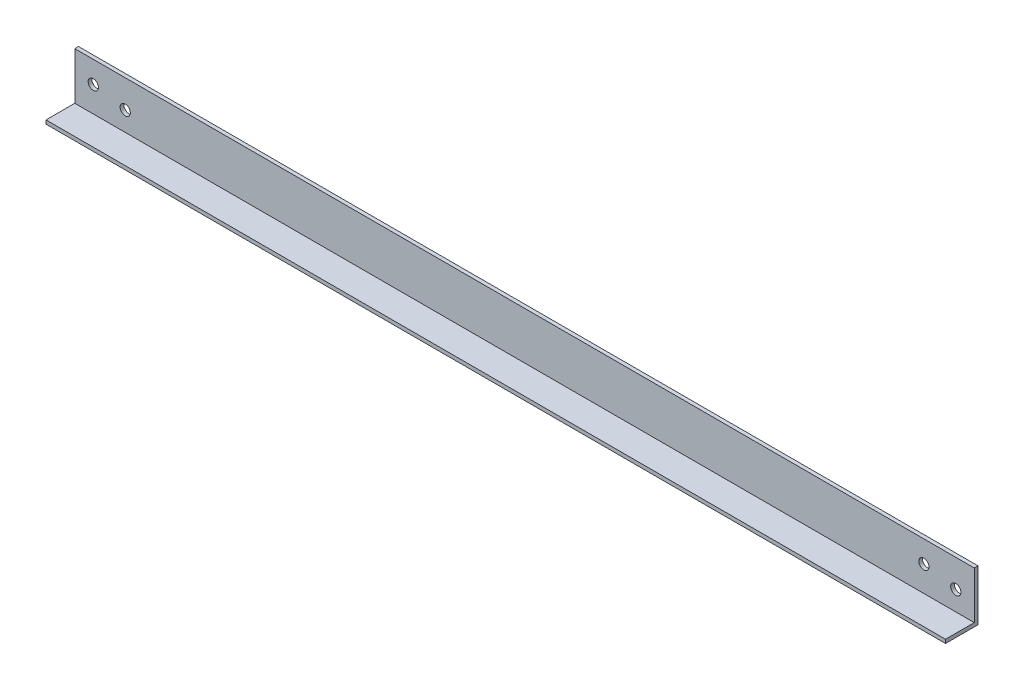
ISO-10303-21;
HEADER;
FILE_DESCRIPTION(('STEP AP214'),'2;1');
FILE_NAME('part.step','',(''),(''),'','','');
FILE_SCHEMA(('AUTOMOTIVE_DESIGN { 1 0 10303 214 1 1 1 1 }'));
ENDSEC;
DATA;
#1=APPLICATION_CONTEXT('core data for automotive mechanical design processes');
#2=APPLICATION_PROTOCOL_DEFINITION('international standard','automotive_design',2000,#1);
#3=PRODUCT_CONTEXT('',#1,'mechanical');
#4=PRODUCT('Part','Part','',(#3));
#5=PRODUCT_RELATED_PRODUCT_CATEGORY('part','',(#4));
#6=PRODUCT_DEFINITION_FORMATION('','',#4);
#7=PRODUCT_DEFINITION_CONTEXT('part definition',#1,'design');
#8=PRODUCT_DEFINITION('design','',#6,#7);
#9=PRODUCT_DEFINITION_SHAPE('','',#8);
#10=(LENGTH_UNIT() NAMED_UNIT(*) SI_UNIT(.MILLI.,.METRE.));
#11=(NAMED_UNIT(*) PLANE_ANGLE_UNIT() SI_UNIT($,.RADIAN.));
#12=(NAMED_UNIT(*) SI_UNIT($,.STERADIAN.) SOLID_ANGLE_UNIT());
#13=UNCERTAINTY_MEASURE_WITH_UNIT(LENGTH_MEASURE(1.E-05),#10,'distance_accuracy_value','');
#14=(GEOMETRIC_REPRESENTATION_CONTEXT(3) GLOBAL_UNCERTAINTY_ASSIGNED_CONTEXT((#13)) GLOBAL_UNIT_ASSIGNED_CONTEXT((#10,
#11,#12)) REPRESENTATION_CONTEXT('',''));
#15=CARTESIAN_POINT('',(0.,0.,0.));
#16=DIRECTION('',(0.,0.,1.));
#17=DIRECTION('',(1.,0.,0.));
#18=AXIS2_PLACEMENT_3D('',#15,#16,#17);
#19=CARTESIAN_POINT('',(0.,110.,8.));
#20=DIRECTION('',(0.,0.,-1.));
#21=DIRECTION('',(-1.,0.,0.));
#22=AXIS2_PLACEMENT_3D('',#19,#20,#21);
#23=PLANE('',#22);
#24=CARTESIAN_POINT('',(39.8880400691979,62.9203216164554,8.));
#25=DIRECTION('',(0.,0.,-1.));
#26=DIRECTION('',(-1.,0.,0.));
#27=AXIS2_PLACEMENT_3D('',#24,#25,#26);
#28=CIRCLE('',#27,11.);
#29=CARTESIAN_POINT('',(28.8880400691979,62.9203216164554,8.));
#30=VERTEX_POINT('',#29);
#31=EDGE_CURVE('E160',#30,#30,#28,.T.);
#32=ORIENTED_EDGE('',*,*,#31,.T.);
#33=EDGE_LOOP('',(#32));
#34=FACE_BOUND('',#33,.T.);
#35=CARTESIAN_POINT('',(108.684226659207,49.9999999999997,8.));
#36=DIRECTION('',(0.,0.,-1.));
#37=DIRECTION('',(-1.,0.,0.));
#38=AXIS2_PLACEMENT_3D('',#35,#36,#37);
#39=CIRCLE('',#38,11.);
#40=CARTESIAN_POINT('',(97.684226659207,49.9999999999997,8.));
#41=VERTEX_POINT('',#40);
#42=EDGE_CURVE('E154',#41,#41,#39,.T.);
#43=ORIENTED_EDGE('',*,*,#42,.T.);
#44=EDGE_LOOP('',(#43));
#45=FACE_BOUND('',#44,.T.);
#46=CARTESIAN_POINT('',(1829.36068952568,62.9203216164554,8.));
#47=DIRECTION('',(0.,0.,-1.));
#48=DIRECTION('',(-1.,0.,0.));
#49=AXIS2_PLACEMENT_3D('',#46,#47,#48);
#50=CIRCLE('',#49,10.9999999999999);
#51=CARTESIAN_POINT('',(1818.36068952568,62.9203216164554,8.));
#52=VERTEX_POINT('',#51);
#53=EDGE_CURVE('E148',#52,#52,#50,.T.);
#54=ORIENTED_EDGE('',*,*,#53,.T.);
#55=EDGE_LOOP('',(#54));
#56=FACE_BOUND('',#55,.T.);
#57=CARTESIAN_POINT('',(1898.15687611569,49.9999999999997,8.));
#58=DIRECTION('',(0.,0.,-1.));
#59=DIRECTION('',(-1.,0.,0.));
#60=AXIS2_PLACEMENT_3D('',#57,#58,#59);
#61=CIRCLE('',#60,10.9999999999999);
#62=CARTESIAN_POINT('',(1887.15687611569,49.9999999999997,8.));
#63=VERTEX_POINT('',#62);
#64=EDGE_CURVE('E123',#63,#63,#61,.T.);
#65=ORIENTED_EDGE('',*,*,#64,.T.);
#66=EDGE_LOOP('',(#65));
#67=FACE_BOUND('',#66,.T.);
#68=DIRECTION('',(-1.,0.,0.));
#69=VECTOR('',#68,1.);
#70=CARTESIAN_POINT('',(0.,8.,8.));
#71=LINE('',#70,#69);
#72=CARTESIAN_POINT('',(1938.,8.,8.));
#73=VERTEX_POINT('',#72);
#74=CARTESIAN_POINT('',(0.,8.,8.));
#75=VERTEX_POINT('',#74);
#76=EDGE_CURVE('E52',#73,#75,#71,.T.);
#77=ORIENTED_EDGE('',*,*,#76,.F.);
#78=DIRECTION('',(0.,1.,0.));
#79=VECTOR('',#78,1.);
#80=CARTESIAN_POINT('',(1938.,0.,8.));
#81=LINE('',#80,#79);
#82=CARTESIAN_POINT('',(1938.,110.,8.));
#83=VERTEX_POINT('',#82);
#84=EDGE_CURVE('E112',#73,#83,#81,.T.);
#85=ORIENTED_EDGE('',*,*,#84,.T.);
#86=DIRECTION('',(-1.,0.,0.));
#87=VECTOR('',#86,1.);
#88=CARTESIAN_POINT('',(0.,110.,8.));
#89=LINE('',#88,#87);
#90=CARTESIAN_POINT('',(0.,110.,8.));
#91=VERTEX_POINT('',#90);
#92=EDGE_CURVE('E58',#83,#91,#89,.T.);
#93=ORIENTED_EDGE('',*,*,#92,.T.);
#94=DIRECTION('',(0.,-1.,0.));
#95=VECTOR('',#94,1.);
#96=CARTESIAN_POINT('',(0.,0.,8.));
#97=LINE('',#96,#95);
#98=EDGE_CURVE('E87',#91,#75,#97,.T.);
#99=ORIENTED_EDGE('',*,*,#98,.T.);
#100=EDGE_LOOP('',(#77,#85,#93,#99));
#101=FACE_BOUND('',#100,.T.);
#102=ADVANCED_FACE('F35',(#34,#45,#56,#67,#101),#23,.F.);
#103=CARTESIAN_POINT('',(0.,0.,8.));
#104=DIRECTION('',(1.,0.,0.));
#105=DIRECTION('',(0.,0.,-1.));
#106=AXIS2_PLACEMENT_3D('',#103,#104,#105);
#107=PLANE('',#106);
#108=DIRECTION('',(0.,-1.,0.));
#109=VECTOR('',#108,1.);
#110=CARTESIAN_POINT('',(0.,0.,0.));
#111=LINE('',#110,#109);
#112=CARTESIAN_POINT('',(0.,110.,0.));
#113=VERTEX_POINT('',#112);
#114=CARTESIAN_POINT('',(0.,0.,0.));
#115=VERTEX_POINT('',#114);
#116=EDGE_CURVE('E93',#113,#115,#111,.T.);
#117=ORIENTED_EDGE('',*,*,#116,.T.);
#118=DIRECTION('',(0.,0.,-1.));
#119=VECTOR('',#118,1.);
#120=CARTESIAN_POINT('',(0.,0.,8.));
#121=LINE('',#120,#119);
#122=CARTESIAN_POINT('',(0.,0.,70.));
#123=VERTEX_POINT('',#122);
#124=EDGE_CURVE('E11',#123,#115,#121,.T.);
#125=ORIENTED_EDGE('',*,*,#124,.F.);
#126=DIRECTION('',(0.,-1.,0.));
#127=VECTOR('',#126,1.);
#128=CARTESIAN_POINT('',(0.,0.,70.));
#129=LINE('',#128,#127);
#130=CARTESIAN_POINT('',(0.,8.,70.));
#131=VERTEX_POINT('',#130);
#132=EDGE_CURVE('E122',#131,#123,#129,.T.);
#133=ORIENTED_EDGE('',*,*,#132,.F.);
#134=DIRECTION('',(0.,0.,-1.));
#135=VECTOR('',#134,1.);
#136=CARTESIAN_POINT('',(0.,8.,70.));
#137=LINE('',#136,#135);
#138=EDGE_CURVE('E102',#131,#75,#137,.T.);
#139=ORIENTED_EDGE('',*,*,#138,.T.);
#140=ORIENTED_EDGE('',*,*,#98,.F.);
#141=DIRECTION('',(0.,0.,-1.));
#142=VECTOR('',#141,1.);
#143=CARTESIAN_POINT('',(0.,110.,8.));
#144=LINE('',#143,#142);
#145=EDGE_CURVE('E80',#91,#113,#144,.T.);
#146=ORIENTED_EDGE('',*,*,#145,.T.);
#147=EDGE_LOOP('',(#117,#125,#133,#139,#140,#146));
#148=FACE_BOUND('',#147,.T.);
#149=ADVANCED_FACE('F37',(#148),#107,.F.);
#150=CARTESIAN_POINT('',(0.,0.,8.));
#151=DIRECTION('',(0.,1.,0.));
#152=DIRECTION('',(0.,0.,1.));
#153=AXIS2_PLACEMENT_3D('',#150,#151,#152);
#154=PLANE('',#153);
#155=DIRECTION('',(1.,0.,0.));
#156=VECTOR('',#155,1.);
#157=CARTESIAN_POINT('',(0.,0.,0.));
#158=LINE('',#157,#156);
#159=CARTESIAN_POINT('',(1938.,0.,0.));
#160=VERTEX_POINT('',#159);
#161=EDGE_CURVE('E97',#115,#160,#158,.T.);
#162=ORIENTED_EDGE('',*,*,#161,.T.);
#163=DIRECTION('',(0.,0.,-1.));
#164=VECTOR('',#163,1.);
#165=CARTESIAN_POINT('',(1938.,0.,8.));
#166=LINE('',#165,#164);
#167=CARTESIAN_POINT('',(1938.,0.,70.));
#168=VERTEX_POINT('',#167);
#169=EDGE_CURVE('E44',#168,#160,#166,.T.);
#170=ORIENTED_EDGE('',*,*,#169,.F.);
#171=DIRECTION('',(1.,0.,0.));
#172=VECTOR('',#171,1.);
#173=CARTESIAN_POINT('',(0.,0.,70.));
#174=LINE('',#173,#172);
#175=EDGE_CURVE('E135',#123,#168,#174,.T.);
#176=ORIENTED_EDGE('',*,*,#175,.F.);
#177=ORIENTED_EDGE('',*,*,#124,.T.);
#178=EDGE_LOOP('',(#162,#170,#176,#177));
#179=FACE_BOUND('',#178,.T.);
#180=ADVANCED_FACE('F194',(#179),#154,.F.);
#181=CARTESIAN_POINT('',(1938.,0.,8.));
#182=DIRECTION('',(-1.,0.,0.));
#183=DIRECTION('',(0.,0.,1.));
#184=AXIS2_PLACEMENT_3D('',#181,#182,#183);
#185=PLANE('',#184);
#186=DIRECTION('',(0.,1.,0.));
#187=VECTOR('',#186,1.);
#188=CARTESIAN_POINT('',(1938.,0.,0.));
#189=LINE('',#188,#187);
#190=CARTESIAN_POINT('',(1938.,110.,0.));
#191=VERTEX_POINT('',#190);
#192=EDGE_CURVE('E88',#160,#191,#189,.T.);
#193=ORIENTED_EDGE('',*,*,#192,.T.);
#194=DIRECTION('',(0.,0.,-1.));
#195=VECTOR('',#194,1.);
#196=CARTESIAN_POINT('',(1938.,110.,8.));
#197=LINE('',#196,#195);
#198=EDGE_CURVE('E83',#83,#191,#197,.T.);
#199=ORIENTED_EDGE('',*,*,#198,.F.);
#200=ORIENTED_EDGE('',*,*,#84,.F.);
#201=DIRECTION('',(0.,0.,-1.));
#202=VECTOR('',#201,1.);
#203=CARTESIAN_POINT('',(1938.,8.,70.));
#204=LINE('',#203,#202);
#205=CARTESIAN_POINT('',(1938.,8.,70.));
#206=VERTEX_POINT('',#205);
#207=EDGE_CURVE('E98',#206,#73,#204,.T.);
#208=ORIENTED_EDGE('',*,*,#207,.F.);
#209=DIRECTION('',(0.,1.,0.));
#210=VECTOR('',#209,1.);
#211=CARTESIAN_POINT('',(1938.,0.,70.));
#212=LINE('',#211,#210);
#213=EDGE_CURVE('E130',#168,#206,#212,.T.);
#214=ORIENTED_EDGE('',*,*,#213,.F.);
#215=ORIENTED_EDGE('',*,*,#169,.T.);
#216=EDGE_LOOP('',(#193,#199,#200,#208,#214,#215));
#217=FACE_BOUND('',#216,.T.);
#218=ADVANCED_FACE('F201',(#217),#185,.F.);
#219=CARTESIAN_POINT('',(0.,110.,8.));
#220=DIRECTION('',(0.,-1.,0.));
#221=DIRECTION('',(0.,0.,-1.));
#222=AXIS2_PLACEMENT_3D('',#219,#220,#221);
#223=PLANE('',#222);
#224=DIRECTION('',(-1.,0.,0.));
#225=VECTOR('',#224,1.);
#226=CARTESIAN_POINT('',(0.,110.,0.));
#227=LINE('',#226,#225);
#228=EDGE_CURVE('E77',#191,#113,#227,.T.);
#229=ORIENTED_EDGE('',*,*,#228,.T.);
#230=ORIENTED_EDGE('',*,*,#145,.F.);
#231=ORIENTED_EDGE('',*,*,#92,.F.);
#232=ORIENTED_EDGE('',*,*,#198,.T.);
#233=EDGE_LOOP('',(#229,#230,#231,#232));
#234=FACE_BOUND('',#233,.T.);
#235=ADVANCED_FACE('F79',(#234),#223,.F.);
#236=CARTESIAN_POINT('',(0.,110.,0.));
#237=DIRECTION('',(0.,0.,-1.));
#238=DIRECTION('',(-1.,0.,0.));
#239=AXIS2_PLACEMENT_3D('',#236,#237,#238);
#240=PLANE('',#239);
#241=CARTESIAN_POINT('',(39.8880400691979,62.9203216164554,0.));
#242=DIRECTION('',(0.,0.,-1.));
#243=DIRECTION('',(-1.,0.,0.));
#244=AXIS2_PLACEMENT_3D('',#241,#242,#243);
#245=CIRCLE('',#244,11.);
#246=CARTESIAN_POINT('',(28.8880400691979,62.9203216164554,0.));
#247=VERTEX_POINT('',#246);
#248=EDGE_CURVE('E163',#247,#247,#245,.T.);
#249=ORIENTED_EDGE('',*,*,#248,.F.);
#250=EDGE_LOOP('',(#249));
#251=FACE_BOUND('',#250,.T.);
#252=CARTESIAN_POINT('',(108.684226659207,49.9999999999997,0.));
#253=DIRECTION('',(0.,0.,-1.));
#254=DIRECTION('',(-1.,0.,0.));
#255=AXIS2_PLACEMENT_3D('',#252,#253,#254);
#256=CIRCLE('',#255,11.);
#257=CARTESIAN_POINT('',(97.684226659207,49.9999999999997,0.));
#258=VERTEX_POINT('',#257);
#259=EDGE_CURVE('E157',#258,#258,#256,.T.);
#260=ORIENTED_EDGE('',*,*,#259,.F.);
#261=EDGE_LOOP('',(#260));
#262=FACE_BOUND('',#261,.T.);
#263=CARTESIAN_POINT('',(1829.36068952568,62.9203216164554,0.));
#264=DIRECTION('',(0.,0.,-1.));
#265=DIRECTION('',(-1.,0.,0.));
#266=AXIS2_PLACEMENT_3D('',#263,#264,#265);
#267=CIRCLE('',#266,10.9999999999999);
#268=CARTESIAN_POINT('',(1818.36068952568,62.9203216164554,0.));
#269=VERTEX_POINT('',#268);
#270=EDGE_CURVE('E151',#269,#269,#267,.T.);
#271=ORIENTED_EDGE('',*,*,#270,.F.);
#272=EDGE_LOOP('',(#271));
#273=FACE_BOUND('',#272,.T.);
#274=CARTESIAN_POINT('',(1898.15687611569,49.9999999999997,0.));
#275=DIRECTION('',(0.,0.,-1.));
#276=DIRECTION('',(-1.,0.,0.));
#277=AXIS2_PLACEMENT_3D('',#274,#275,#276);
#278=CIRCLE('',#277,10.9999999999999);
#279=CARTESIAN_POINT('',(1887.15687611569,49.9999999999997,0.));
#280=VERTEX_POINT('',#279);
#281=EDGE_CURVE('E145',#280,#280,#278,.T.);
#282=ORIENTED_EDGE('',*,*,#281,.F.);
#283=EDGE_LOOP('',(#282));
#284=FACE_BOUND('',#283,.T.);
#285=ORIENTED_EDGE('',*,*,#116,.F.);
#286=ORIENTED_EDGE('',*,*,#228,.F.);
#287=ORIENTED_EDGE('',*,*,#192,.F.);
#288=ORIENTED_EDGE('',*,*,#161,.F.);
#289=EDGE_LOOP('',(#285,#286,#287,#288));
#290=FACE_BOUND('',#289,.T.);
#291=ADVANCED_FACE('F96',(#251,#262,#273,#284,#290),#240,.T.);
#292=CARTESIAN_POINT('',(0.,8.,70.));
#293=DIRECTION('',(0.,-1.,0.));
#294=DIRECTION('',(0.,0.,-1.));
#295=AXIS2_PLACEMENT_3D('',#292,#293,#294);
#296=PLANE('',#295);
#297=ORIENTED_EDGE('',*,*,#76,.T.);
#298=ORIENTED_EDGE('',*,*,#138,.F.);
#299=DIRECTION('',(-1.,0.,0.));
#300=VECTOR('',#299,1.);
#301=CARTESIAN_POINT('',(0.,8.,70.));
#302=LINE('',#301,#300);
#303=EDGE_CURVE('E119',#206,#131,#302,.T.);
#304=ORIENTED_EDGE('',*,*,#303,.F.);
#305=ORIENTED_EDGE('',*,*,#207,.T.);
#306=EDGE_LOOP('',(#297,#298,#304,#305));
#307=FACE_BOUND('',#306,.T.);
#308=ADVANCED_FACE('F172',(#307),#296,.F.);
#309=CARTESIAN_POINT('',(0.,8.,70.));
#310=DIRECTION('',(0.,0.,-1.));
#311=DIRECTION('',(-1.,0.,0.));
#312=AXIS2_PLACEMENT_3D('',#309,#310,#311);
#313=PLANE('',#312);
#314=ORIENTED_EDGE('',*,*,#132,.T.);
#315=ORIENTED_EDGE('',*,*,#175,.T.);
#316=ORIENTED_EDGE('',*,*,#213,.T.);
#317=ORIENTED_EDGE('',*,*,#303,.T.);
#318=EDGE_LOOP('',(#314,#315,#316,#317));
#319=FACE_BOUND('',#318,.T.);
#320=ADVANCED_FACE('F184',(#319),#313,.F.);
#321=CARTESIAN_POINT('',(1898.15687611569,49.9999999999997,70.000025));
#322=DIRECTION('',(0.,0.,-1.));
#323=DIRECTION('',(-1.,0.,0.));
#324=AXIS2_PLACEMENT_3D('',#321,#322,#323);
#325=CYLINDRICAL_SURFACE('',#324,10.9999999999999);
#326=ORIENTED_EDGE('',*,*,#281,.T.);
#327=EDGE_LOOP('',(#326));
#328=FACE_BOUND('',#327,.T.);
#329=ORIENTED_EDGE('',*,*,#64,.F.);
#330=EDGE_LOOP('',(#329));
#331=FACE_BOUND('',#330,.T.);
#332=ADVANCED_FACE('F180',(#328,#331),#325,.F.);
#333=CARTESIAN_POINT('',(1829.36068952568,62.9203216164554,70.000025));
#334=DIRECTION('',(0.,0.,-1.));
#335=DIRECTION('',(-1.,0.,0.));
#336=AXIS2_PLACEMENT_3D('',#333,#334,#335);
#337=CYLINDRICAL_SURFACE('',#336,10.9999999999999);
#338=ORIENTED_EDGE('',*,*,#270,.T.);
#339=EDGE_LOOP('',(#338));
#340=FACE_BOUND('',#339,.T.);
#341=ORIENTED_EDGE('',*,*,#53,.F.);
#342=EDGE_LOOP('',(#341));
#343=FACE_BOUND('',#342,.T.);
#344=ADVANCED_FACE('F183',(#340,#343),#337,.F.);
#345=CARTESIAN_POINT('',(108.684226659207,49.9999999999997,70.000025));
#346=DIRECTION('',(0.,0.,-1.));
#347=DIRECTION('',(-1.,0.,0.));
#348=AXIS2_PLACEMENT_3D('',#345,#346,#347);
#349=CYLINDRICAL_SURFACE('',#348,11.);
#350=ORIENTED_EDGE('',*,*,#259,.T.);
#351=EDGE_LOOP('',(#350));
#352=FACE_BOUND('',#351,.T.);
#353=ORIENTED_EDGE('',*,*,#42,.F.);
#354=EDGE_LOOP('',(#353));
#355=FACE_BOUND('',#354,.T.);
#356=ADVANCED_FACE('F224',(#352,#355),#349,.F.);
#357=CARTESIAN_POINT('',(39.8880400691979,62.9203216164554,70.000025));
#358=DIRECTION('',(0.,0.,-1.));
#359=DIRECTION('',(-1.,0.,0.));
#360=AXIS2_PLACEMENT_3D('',#357,#358,#359);
#361=CYLINDRICAL_SURFACE('',#360,11.);
#362=ORIENTED_EDGE('',*,*,#248,.T.);
#363=EDGE_LOOP('',(#362));
#364=FACE_BOUND('',#363,.T.);
#365=ORIENTED_EDGE('',*,*,#31,.F.);
#366=EDGE_LOOP('',(#365));
#367=FACE_BOUND('',#366,.T.);
#368=ADVANCED_FACE('F167',(#364,#367),#361,.F.);
#369=CLOSED_SHELL('',(#102,#149,#180,#218,#235,#291,#308,#320,#332,#344,#356,#368));
#370=MANIFOLD_SOLID_BREP('B2',#369);
#371=ADVANCED_BREP_SHAPE_REPRESENTATION('',(#18,#370),#14);
#372=SHAPE_DEFINITION_REPRESENTATION(#9,#371);
ENDSEC;
END-ISO-10303-21;
